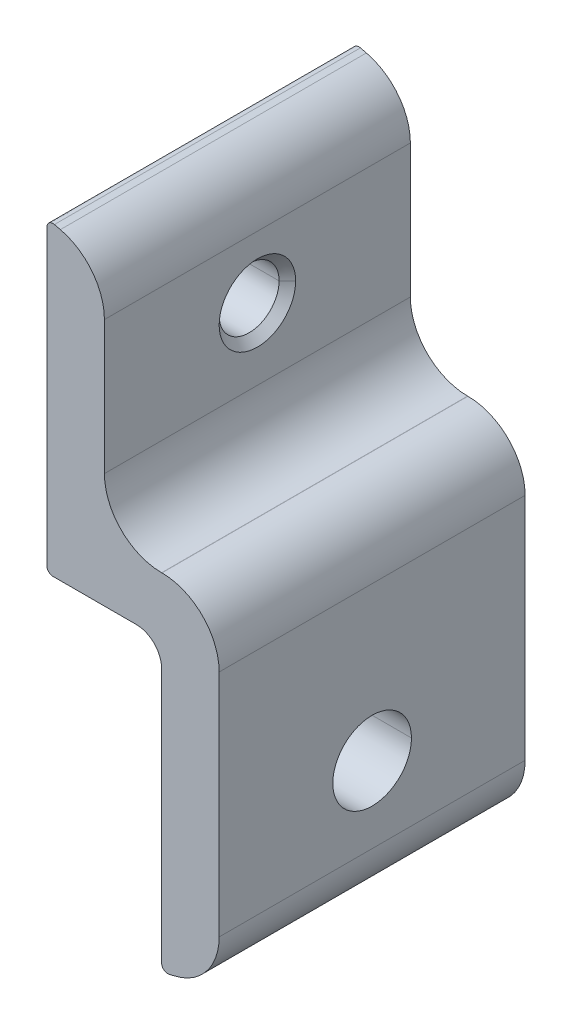
ISO-10303-21;
HEADER;
FILE_DESCRIPTION(('STEP AP214'),'2;1');
FILE_NAME('part.step','',(''),(''),'','','');
FILE_SCHEMA(('AUTOMOTIVE_DESIGN { 1 0 10303 214 1 1 1 1 }'));
ENDSEC;
DATA;
#1=APPLICATION_CONTEXT('core data for automotive mechanical design processes');
#2=APPLICATION_PROTOCOL_DEFINITION('international standard','automotive_design',2000,#1);
#3=PRODUCT_CONTEXT('',#1,'mechanical');
#4=PRODUCT('Part','Part','',(#3));
#5=PRODUCT_RELATED_PRODUCT_CATEGORY('part','',(#4));
#6=PRODUCT_DEFINITION_FORMATION('','',#4);
#7=PRODUCT_DEFINITION_CONTEXT('part definition',#1,'design');
#8=PRODUCT_DEFINITION('design','',#6,#7);
#9=PRODUCT_DEFINITION_SHAPE('','',#8);
#10=(LENGTH_UNIT() NAMED_UNIT(*) SI_UNIT(.MILLI.,.METRE.));
#11=(NAMED_UNIT(*) PLANE_ANGLE_UNIT() SI_UNIT($,.RADIAN.));
#12=(NAMED_UNIT(*) SI_UNIT($,.STERADIAN.) SOLID_ANGLE_UNIT());
#13=UNCERTAINTY_MEASURE_WITH_UNIT(LENGTH_MEASURE(1.E-05),#10,'distance_accuracy_value','');
#14=(GEOMETRIC_REPRESENTATION_CONTEXT(3) GLOBAL_UNCERTAINTY_ASSIGNED_CONTEXT((#13)) GLOBAL_UNIT_ASSIGNED_CONTEXT((#10,
#11,#12)) REPRESENTATION_CONTEXT('',''));
#15=CARTESIAN_POINT('',(0.,0.,0.));
#16=DIRECTION('',(0.,0.,1.));
#17=DIRECTION('',(1.,0.,0.));
#18=AXIS2_PLACEMENT_3D('',#15,#16,#17);
#19=CARTESIAN_POINT('',(4.7752,9.525,12.7));
#20=DIRECTION('',(-1.,0.,0.));
#21=DIRECTION('',(0.,0.,1.));
#22=AXIS2_PLACEMENT_3D('',#19,#20,#21);
#23=PLANE('',#22);
#24=CARTESIAN_POINT('',(4.7752,15.4432,0.));
#25=DIRECTION('',(1.,0.,0.));
#26=DIRECTION('',(0.,0.,-1.));
#27=AXIS2_PLACEMENT_3D('',#24,#25,#26);
#28=CIRCLE('',#27,3.175);
#29=CARTESIAN_POINT('',(4.7752,15.4432,-3.175));
#30=VERTEX_POINT('',#29);
#31=CARTESIAN_POINT('',(4.7752,15.4432,3.175));
#32=VERTEX_POINT('',#31);
#33=EDGE_CURVE('E11',#30,#32,#28,.T.);
#34=ORIENTED_EDGE('',*,*,#33,.F.);
#35=CARTESIAN_POINT('',(4.7752,15.4432,0.));
#36=DIRECTION('',(1.,0.,0.));
#37=DIRECTION('',(0.,0.,-1.));
#38=AXIS2_PLACEMENT_3D('',#35,#36,#37);
#39=CIRCLE('',#38,3.175);
#40=EDGE_CURVE('E25',#32,#30,#39,.T.);
#41=ORIENTED_EDGE('',*,*,#40,.F.);
#42=EDGE_LOOP('',(#34,#41));
#43=FACE_BOUND('',#42,.T.);
#44=DIRECTION('',(0.,1.,0.));
#45=VECTOR('',#44,1.);
#46=CARTESIAN_POINT('',(4.7752,9.525,-12.7));
#47=LINE('',#46,#45);
#48=CARTESIAN_POINT('',(4.7752,9.52499999999987,-12.7));
#49=VERTEX_POINT('',#48);
#50=CARTESIAN_POINT('',(4.7752,20.5994,-12.7));
#51=VERTEX_POINT('',#50);
#52=EDGE_CURVE('E591',#49,#51,#47,.T.);
#53=ORIENTED_EDGE('',*,*,#52,.T.);
#54=DIRECTION('',(0.,0.,-1.));
#55=VECTOR('',#54,1.);
#56=CARTESIAN_POINT('',(4.7752,20.5994,12.7));
#57=LINE('',#56,#55);
#58=CARTESIAN_POINT('',(4.7752,20.5994,12.7));
#59=VERTEX_POINT('',#58);
#60=EDGE_CURVE('E586',#59,#51,#57,.T.);
#61=ORIENTED_EDGE('',*,*,#60,.F.);
#62=DIRECTION('',(0.,1.,0.));
#63=VECTOR('',#62,1.);
#64=CARTESIAN_POINT('',(4.7752,9.525,12.7));
#65=LINE('',#64,#63);
#66=CARTESIAN_POINT('',(4.7752,9.52499999999987,12.7));
#67=VERTEX_POINT('',#66);
#68=EDGE_CURVE('E581',#67,#59,#65,.T.);
#69=ORIENTED_EDGE('',*,*,#68,.F.);
#70=DIRECTION('',(0.,0.,-1.));
#71=VECTOR('',#70,1.);
#72=CARTESIAN_POINT('',(4.7752,9.52499999999987,12.7));
#73=LINE('',#72,#71);
#74=EDGE_CURVE('E577',#67,#49,#73,.T.);
#75=ORIENTED_EDGE('',*,*,#74,.T.);
#76=EDGE_LOOP('',(#53,#61,#69,#75));
#77=FACE_BOUND('',#76,.T.);
#78=ADVANCED_FACE('F17',(#43,#77),#23,.F.);
#79=CARTESIAN_POINT('',(9.52499999999987,9.52499999999987,12.7));
#80=DIRECTION('',(0.,0.,1.));
#81=DIRECTION('',(0.707106781186538,0.707106781186557,0.));
#82=AXIS2_PLACEMENT_3D('',#79,#80,#81);
#83=CYLINDRICAL_SURFACE('',#82,4.74979999999987);
#84=DIRECTION('',(0.,0.,-1.));
#85=VECTOR('',#84,1.);
#86=CARTESIAN_POINT('',(9.525,4.7752,12.7));
#87=LINE('',#86,#85);
#88=CARTESIAN_POINT('',(9.525,4.7752,12.7));
#89=VERTEX_POINT('',#88);
#90=CARTESIAN_POINT('',(9.525,4.7752,-12.7));
#91=VERTEX_POINT('',#90);
#92=EDGE_CURVE('E573',#89,#91,#87,.T.);
#93=ORIENTED_EDGE('',*,*,#92,.T.);
#94=CARTESIAN_POINT('',(9.52499999999987,9.52499999999987,-12.7));
#95=DIRECTION('',(0.,0.,1.));
#96=DIRECTION('',(1.,0.,0.));
#97=AXIS2_PLACEMENT_3D('',#94,#95,#96);
#98=CIRCLE('',#97,4.74979999999987);
#99=EDGE_CURVE('E568',#49,#91,#98,.T.);
#100=ORIENTED_EDGE('',*,*,#99,.F.);
#101=ORIENTED_EDGE('',*,*,#74,.F.);
#102=CARTESIAN_POINT('',(9.52499999999987,9.52499999999987,12.7));
#103=DIRECTION('',(0.,0.,1.));
#104=DIRECTION('',(1.,0.,0.));
#105=AXIS2_PLACEMENT_3D('',#102,#103,#104);
#106=CIRCLE('',#105,4.74979999999987);
#107=EDGE_CURVE('E564',#67,#89,#106,.T.);
#108=ORIENTED_EDGE('',*,*,#107,.T.);
#109=EDGE_LOOP('',(#93,#100,#101,#108));
#110=FACE_BOUND('',#109,.T.);
#111=ADVANCED_FACE('F605',(#110),#83,.F.);
#112=CARTESIAN_POINT('',(0.507999999999987,0.507999999999987,12.7));
#113=DIRECTION('',(0.,0.,1.));
#114=DIRECTION('',(1.,0.,0.));
#115=AXIS2_PLACEMENT_3D('',#112,#113,#114);
#116=PLANE('',#115);
#117=DIRECTION('',(0.,-1.,0.));
#118=VECTOR('',#117,1.);
#119=CARTESIAN_POINT('',(0.,24.8666,12.7));
#120=LINE('',#119,#118);
#121=CARTESIAN_POINT('',(0.,24.8666,12.7));
#122=VERTEX_POINT('',#121);
#123=CARTESIAN_POINT('',(0.,0.507999999999987,12.7));
#124=VERTEX_POINT('',#123);
#125=EDGE_CURVE('E560',#122,#124,#120,.T.);
#126=ORIENTED_EDGE('',*,*,#125,.T.);
#127=CARTESIAN_POINT('',(0.507999999999987,0.507999999999987,12.7));
#128=DIRECTION('',(0.,0.,1.));
#129=DIRECTION('',(1.,0.,0.));
#130=AXIS2_PLACEMENT_3D('',#127,#128,#129);
#131=CIRCLE('',#130,0.507999999999987);
#132=CARTESIAN_POINT('',(0.507999999999987,0.,12.7));
#133=VERTEX_POINT('',#132);
#134=EDGE_CURVE('E556',#124,#133,#131,.T.);
#135=ORIENTED_EDGE('',*,*,#134,.T.);
#136=DIRECTION('',(1.,0.,0.));
#137=VECTOR('',#136,1.);
#138=CARTESIAN_POINT('',(0.508,0.,12.7));
#139=LINE('',#138,#137);
#140=CARTESIAN_POINT('',(7.4168,0.,12.7));
#141=VERTEX_POINT('',#140);
#142=EDGE_CURVE('E552',#133,#141,#139,.T.);
#143=ORIENTED_EDGE('',*,*,#142,.T.);
#144=CARTESIAN_POINT('',(7.41680000000002,-2.10819999999996,12.7));
#145=DIRECTION('',(0.,0.,1.));
#146=DIRECTION('',(1.,0.,0.));
#147=AXIS2_PLACEMENT_3D('',#144,#145,#146);
#148=CIRCLE('',#147,2.10819999999996);
#149=CARTESIAN_POINT('',(9.525,-2.10819999999996,12.7));
#150=VERTEX_POINT('',#149);
#151=EDGE_CURVE('E547',#150,#141,#148,.T.);
#152=ORIENTED_EDGE('',*,*,#151,.F.);
#153=DIRECTION('',(0.,-1.,0.));
#154=VECTOR('',#153,1.);
#155=CARTESIAN_POINT('',(9.525,-2.1082,12.7));
#156=LINE('',#155,#154);
#157=CARTESIAN_POINT('',(9.525,-23.2918,12.7));
#158=VERTEX_POINT('',#157);
#159=EDGE_CURVE('E543',#150,#158,#156,.T.);
#160=ORIENTED_EDGE('',*,*,#159,.T.);
#161=CARTESIAN_POINT('',(10.0330000000002,-23.2918000000001,12.7));
#162=DIRECTION('',(0.,0.,1.));
#163=DIRECTION('',(1.,0.,0.));
#164=AXIS2_PLACEMENT_3D('',#161,#162,#163);
#165=CIRCLE('',#164,0.508000000000216);
#166=CARTESIAN_POINT('',(10.15226215763,-23.785602124092,12.7));
#167=VERTEX_POINT('',#166);
#168=EDGE_CURVE('E539',#158,#167,#165,.T.);
#169=ORIENTED_EDGE('',*,*,#168,.T.);
#170=DIRECTION('',(0.972051425377323,0.234768026830559,0.));
#171=VECTOR('',#170,1.);
#172=CARTESIAN_POINT('',(10.15226215763,-23.785602124092,12.7));
#173=LINE('',#172,#171);
#174=CARTESIAN_POINT('',(10.646064281722,-23.666339966462,12.7));
#175=VERTEX_POINT('',#174);
#176=EDGE_CURVE('E535',#167,#175,#173,.T.);
#177=ORIENTED_EDGE('',*,*,#176,.T.);
#178=CARTESIAN_POINT('',(9.52499999999985,-19.0246000000003,12.7));
#179=DIRECTION('',(0.,0.,1.));
#180=DIRECTION('',(1.,0.,0.));
#181=AXIS2_PLACEMENT_3D('',#178,#179,#180);
#182=CIRCLE('',#181,4.77520000000015);
#183=CARTESIAN_POINT('',(14.3002,-19.0246000000003,12.7));
#184=VERTEX_POINT('',#183);
#185=EDGE_CURVE('E531',#175,#184,#182,.T.);
#186=ORIENTED_EDGE('',*,*,#185,.T.);
#187=DIRECTION('',(0.,1.,0.));
#188=VECTOR('',#187,1.);
#189=CARTESIAN_POINT('',(14.3002,-19.0246,12.7));
#190=LINE('',#189,#188);
#191=CARTESIAN_POINT('',(14.3002,0.0253999999999983,12.7));
#192=VERTEX_POINT('',#191);
#193=EDGE_CURVE('E527',#184,#192,#190,.T.);
#194=ORIENTED_EDGE('',*,*,#193,.T.);
#195=CARTESIAN_POINT('',(9.5504000000003,0.0254000000002934,12.7));
#196=DIRECTION('',(0.,0.,1.));
#197=DIRECTION('',(1.,0.,0.));
#198=AXIS2_PLACEMENT_3D('',#195,#196,#197);
#199=CIRCLE('',#198,4.74979999999969);
#200=CARTESIAN_POINT('',(9.5504000000003,4.7752,12.7));
#201=VERTEX_POINT('',#200);
#202=EDGE_CURVE('E523',#192,#201,#199,.T.);
#203=ORIENTED_EDGE('',*,*,#202,.T.);
#204=DIRECTION('',(-1.,0.,0.));
#205=VECTOR('',#204,1.);
#206=CARTESIAN_POINT('',(9.5504,4.7752,12.7));
#207=LINE('',#206,#205);
#208=EDGE_CURVE('E518',#201,#89,#207,.T.);
#209=ORIENTED_EDGE('',*,*,#208,.T.);
#210=ORIENTED_EDGE('',*,*,#107,.F.);
#211=ORIENTED_EDGE('',*,*,#68,.T.);
#212=CARTESIAN_POINT('',(-8.34401991944845E-13,20.5993999999996,12.7));
#213=DIRECTION('',(0.,0.,1.));
#214=DIRECTION('',(1.,0.,0.));
#215=AXIS2_PLACEMENT_3D('',#212,#213,#214);
#216=CIRCLE('',#215,4.77520000000084);
#217=CARTESIAN_POINT('',(1.1210642817217,25.241139966462,12.7));
#218=VERTEX_POINT('',#217);
#219=EDGE_CURVE('E514',#59,#218,#216,.T.);
#220=ORIENTED_EDGE('',*,*,#219,.T.);
#221=DIRECTION('',(-0.972051425377295,0.234768026830676,0.));
#222=VECTOR('',#221,1.);
#223=CARTESIAN_POINT('',(1.1210642817217,25.241139966462,12.7));
#224=LINE('',#223,#222);
#225=CARTESIAN_POINT('',(0.62726215762996,25.360402124092,12.7));
#226=VERTEX_POINT('',#225);
#227=EDGE_CURVE('E510',#218,#226,#224,.T.);
#228=ORIENTED_EDGE('',*,*,#227,.T.);
#229=CARTESIAN_POINT('',(0.508000000000218,24.8666,12.7));
#230=DIRECTION('',(0.,0.,1.));
#231=DIRECTION('',(1.,0.,0.));
#232=AXIS2_PLACEMENT_3D('',#229,#230,#231);
#233=CIRCLE('',#232,0.508000000000218);
#234=EDGE_CURVE('E506',#226,#122,#233,.T.);
#235=ORIENTED_EDGE('',*,*,#234,.T.);
#236=EDGE_LOOP('',(#126,#135,#143,#152,#160,#169,#177,#186,#194,#203,#209,#210,#211,#220,#228,#235));
#237=FACE_BOUND('',#236,.T.);
#238=ADVANCED_FACE('F609',(#237),#116,.T.);
#239=CARTESIAN_POINT('',(0.508000000000218,24.8666,12.7));
#240=DIRECTION('',(0.,0.,1.));
#241=DIRECTION('',(0.618559606331476,-0.785737878312513,0.));
#242=AXIS2_PLACEMENT_3D('',#239,#240,#241);
#243=CYLINDRICAL_SURFACE('',#242,0.508000000000218);
#244=CARTESIAN_POINT('',(0.508000000000218,24.8666,-12.7));
#245=DIRECTION('',(0.,0.,1.));
#246=DIRECTION('',(1.,0.,0.));
#247=AXIS2_PLACEMENT_3D('',#244,#245,#246);
#248=CIRCLE('',#247,0.508000000000218);
#249=CARTESIAN_POINT('',(0.62726215762996,25.360402124092,-12.7));
#250=VERTEX_POINT('',#249);
#251=CARTESIAN_POINT('',(0.,24.8666,-12.7));
#252=VERTEX_POINT('',#251);
#253=EDGE_CURVE('E502',#250,#252,#248,.T.);
#254=ORIENTED_EDGE('',*,*,#253,.T.);
#255=DIRECTION('',(0.,0.,-1.));
#256=VECTOR('',#255,1.);
#257=CARTESIAN_POINT('',(0.,24.8666,12.7));
#258=LINE('',#257,#256);
#259=EDGE_CURVE('E497',#122,#252,#258,.T.);
#260=ORIENTED_EDGE('',*,*,#259,.F.);
#261=ORIENTED_EDGE('',*,*,#234,.F.);
#262=DIRECTION('',(0.,0.,-1.));
#263=VECTOR('',#262,1.);
#264=CARTESIAN_POINT('',(0.62726215762996,25.360402124092,12.7));
#265=LINE('',#264,#263);
#266=EDGE_CURVE('E493',#226,#250,#265,.T.);
#267=ORIENTED_EDGE('',*,*,#266,.T.);
#268=EDGE_LOOP('',(#254,#260,#261,#267));
#269=FACE_BOUND('',#268,.T.);
#270=ADVANCED_FACE('F633',(#269),#243,.T.);
#271=CARTESIAN_POINT('',(1.1210642817217,25.241139966462,12.7));
#272=DIRECTION('',(-0.234768026830676,-0.972051425377295,0.));
#273=DIRECTION('',(0.972051425377295,-0.234768026830676,0.));
#274=AXIS2_PLACEMENT_3D('',#271,#272,#273);
#275=PLANE('',#274);
#276=DIRECTION('',(-0.972051425377295,0.234768026830676,0.));
#277=VECTOR('',#276,1.);
#278=CARTESIAN_POINT('',(1.1210642817217,25.241139966462,-12.7));
#279=LINE('',#278,#277);
#280=CARTESIAN_POINT('',(1.1210642817217,25.241139966462,-12.7));
#281=VERTEX_POINT('',#280);
#282=EDGE_CURVE('E488',#281,#250,#279,.T.);
#283=ORIENTED_EDGE('',*,*,#282,.T.);
#284=ORIENTED_EDGE('',*,*,#266,.F.);
#285=ORIENTED_EDGE('',*,*,#227,.F.);
#286=DIRECTION('',(0.,0.,-1.));
#287=VECTOR('',#286,1.);
#288=CARTESIAN_POINT('',(1.1210642817217,25.241139966462,12.7));
#289=LINE('',#288,#287);
#290=EDGE_CURVE('E484',#218,#281,#289,.T.);
#291=ORIENTED_EDGE('',*,*,#290,.T.);
#292=EDGE_LOOP('',(#283,#284,#285,#291));
#293=FACE_BOUND('',#292,.T.);
#294=ADVANCED_FACE('F627',(#293),#275,.F.);
#295=CARTESIAN_POINT('',(-8.34401991944845E-13,20.5993999999996,12.7));
#296=DIRECTION('',(0.,0.,1.));
#297=DIRECTION('',(-0.785737878312729,-0.618559606331201,0.));
#298=AXIS2_PLACEMENT_3D('',#295,#296,#297);
#299=CYLINDRICAL_SURFACE('',#298,4.77520000000084);
#300=CARTESIAN_POINT('',(-8.34401991944845E-13,20.5993999999996,-12.7));
#301=DIRECTION('',(0.,0.,1.));
#302=DIRECTION('',(1.,0.,0.));
#303=AXIS2_PLACEMENT_3D('',#300,#301,#302);
#304=CIRCLE('',#303,4.77520000000084);
#305=EDGE_CURVE('E479',#51,#281,#304,.T.);
#306=ORIENTED_EDGE('',*,*,#305,.T.);
#307=ORIENTED_EDGE('',*,*,#290,.F.);
#308=ORIENTED_EDGE('',*,*,#219,.F.);
#309=ORIENTED_EDGE('',*,*,#60,.T.);
#310=EDGE_LOOP('',(#306,#307,#308,#309));
#311=FACE_BOUND('',#310,.T.);
#312=ADVANCED_FACE('F619',(#311),#299,.T.);
#313=CARTESIAN_POINT('',(0.507999999999987,0.507999999999987,-12.7));
#314=DIRECTION('',(0.,0.,1.));
#315=DIRECTION('',(1.,0.,0.));
#316=AXIS2_PLACEMENT_3D('',#313,#314,#315);
#317=PLANE('',#316);
#318=DIRECTION('',(0.,-1.,0.));
#319=VECTOR('',#318,1.);
#320=CARTESIAN_POINT('',(0.,24.8666,-12.7));
#321=LINE('',#320,#319);
#322=CARTESIAN_POINT('',(0.,0.507999999999987,-12.7));
#323=VERTEX_POINT('',#322);
#324=EDGE_CURVE('E474',#252,#323,#321,.T.);
#325=ORIENTED_EDGE('',*,*,#324,.F.);
#326=ORIENTED_EDGE('',*,*,#253,.F.);
#327=ORIENTED_EDGE('',*,*,#282,.F.);
#328=ORIENTED_EDGE('',*,*,#305,.F.);
#329=ORIENTED_EDGE('',*,*,#52,.F.);
#330=ORIENTED_EDGE('',*,*,#99,.T.);
#331=DIRECTION('',(-1.,0.,0.));
#332=VECTOR('',#331,1.);
#333=CARTESIAN_POINT('',(9.5504,4.7752,-12.7));
#334=LINE('',#333,#332);
#335=CARTESIAN_POINT('',(9.5504000000003,4.7752,-12.7));
#336=VERTEX_POINT('',#335);
#337=EDGE_CURVE('E469',#336,#91,#334,.T.);
#338=ORIENTED_EDGE('',*,*,#337,.F.);
#339=CARTESIAN_POINT('',(9.5504000000003,0.0254000000002934,-12.7));
#340=DIRECTION('',(0.,0.,1.));
#341=DIRECTION('',(1.,0.,0.));
#342=AXIS2_PLACEMENT_3D('',#339,#340,#341);
#343=CIRCLE('',#342,4.74979999999969);
#344=CARTESIAN_POINT('',(14.3002,0.0253999999999983,-12.7));
#345=VERTEX_POINT('',#344);
#346=EDGE_CURVE('E464',#345,#336,#343,.T.);
#347=ORIENTED_EDGE('',*,*,#346,.F.);
#348=DIRECTION('',(0.,1.,0.));
#349=VECTOR('',#348,1.);
#350=CARTESIAN_POINT('',(14.3002,-19.0246,-12.7));
#351=LINE('',#350,#349);
#352=CARTESIAN_POINT('',(14.3002,-19.0246000000003,-12.7));
#353=VERTEX_POINT('',#352);
#354=EDGE_CURVE('E459',#353,#345,#351,.T.);
#355=ORIENTED_EDGE('',*,*,#354,.F.);
#356=CARTESIAN_POINT('',(9.52499999999985,-19.0246000000003,-12.7));
#357=DIRECTION('',(0.,0.,1.));
#358=DIRECTION('',(1.,0.,0.));
#359=AXIS2_PLACEMENT_3D('',#356,#357,#358);
#360=CIRCLE('',#359,4.77520000000015);
#361=CARTESIAN_POINT('',(10.646064281722,-23.666339966462,-12.7));
#362=VERTEX_POINT('',#361);
#363=EDGE_CURVE('E454',#362,#353,#360,.T.);
#364=ORIENTED_EDGE('',*,*,#363,.F.);
#365=DIRECTION('',(0.972051425377323,0.234768026830559,0.));
#366=VECTOR('',#365,1.);
#367=CARTESIAN_POINT('',(10.15226215763,-23.785602124092,-12.7));
#368=LINE('',#367,#366);
#369=CARTESIAN_POINT('',(10.15226215763,-23.785602124092,-12.7));
#370=VERTEX_POINT('',#369);
#371=EDGE_CURVE('E449',#370,#362,#368,.T.);
#372=ORIENTED_EDGE('',*,*,#371,.F.);
#373=CARTESIAN_POINT('',(10.0330000000002,-23.2918000000001,-12.7));
#374=DIRECTION('',(0.,0.,1.));
#375=DIRECTION('',(1.,0.,0.));
#376=AXIS2_PLACEMENT_3D('',#373,#374,#375);
#377=CIRCLE('',#376,0.508000000000216);
#378=CARTESIAN_POINT('',(9.525,-23.2918,-12.7));
#379=VERTEX_POINT('',#378);
#380=EDGE_CURVE('E444',#379,#370,#377,.T.);
#381=ORIENTED_EDGE('',*,*,#380,.F.);
#382=DIRECTION('',(0.,-1.,0.));
#383=VECTOR('',#382,1.);
#384=CARTESIAN_POINT('',(9.525,-2.1082,-12.7));
#385=LINE('',#384,#383);
#386=CARTESIAN_POINT('',(9.525,-2.10819999999996,-12.7));
#387=VERTEX_POINT('',#386);
#388=EDGE_CURVE('E439',#387,#379,#385,.T.);
#389=ORIENTED_EDGE('',*,*,#388,.F.);
#390=CARTESIAN_POINT('',(7.41680000000002,-2.10819999999996,-12.7));
#391=DIRECTION('',(0.,0.,1.));
#392=DIRECTION('',(1.,0.,0.));
#393=AXIS2_PLACEMENT_3D('',#390,#391,#392);
#394=CIRCLE('',#393,2.10819999999996);
#395=CARTESIAN_POINT('',(7.4168,0.,-12.7));
#396=VERTEX_POINT('',#395);
#397=EDGE_CURVE('E435',#387,#396,#394,.T.);
#398=ORIENTED_EDGE('',*,*,#397,.T.);
#399=DIRECTION('',(1.,0.,0.));
#400=VECTOR('',#399,1.);
#401=CARTESIAN_POINT('',(0.508,0.,-12.7));
#402=LINE('',#401,#400);
#403=CARTESIAN_POINT('',(0.507999999999987,0.,-12.7));
#404=VERTEX_POINT('',#403);
#405=EDGE_CURVE('E430',#404,#396,#402,.T.);
#406=ORIENTED_EDGE('',*,*,#405,.F.);
#407=CARTESIAN_POINT('',(0.507999999999987,0.507999999999987,-12.7));
#408=DIRECTION('',(0.,0.,1.));
#409=DIRECTION('',(1.,0.,0.));
#410=AXIS2_PLACEMENT_3D('',#407,#408,#409);
#411=CIRCLE('',#410,0.507999999999987);
#412=EDGE_CURVE('E425',#323,#404,#411,.T.);
#413=ORIENTED_EDGE('',*,*,#412,.F.);
#414=EDGE_LOOP('',(#325,#326,#327,#328,#329,#330,#338,#347,#355,#364,#372,#381,#389,#398,#406,#413));
#415=FACE_BOUND('',#414,.T.);
#416=ADVANCED_FACE('F623',(#415),#317,.F.);
#417=CARTESIAN_POINT('',(0.507999999999987,0.507999999999987,12.7));
#418=DIRECTION('',(0.,0.,1.));
#419=DIRECTION('',(0.707106781186547,0.707106781186548,0.));
#420=AXIS2_PLACEMENT_3D('',#417,#418,#419);
#421=CYLINDRICAL_SURFACE('',#420,0.507999999999987);
#422=ORIENTED_EDGE('',*,*,#412,.T.);
#423=DIRECTION('',(0.,0.,-1.));
#424=VECTOR('',#423,1.);
#425=CARTESIAN_POINT('',(0.507999999999987,0.,12.7));
#426=LINE('',#425,#424);
#427=EDGE_CURVE('E420',#133,#404,#426,.T.);
#428=ORIENTED_EDGE('',*,*,#427,.F.);
#429=ORIENTED_EDGE('',*,*,#134,.F.);
#430=DIRECTION('',(0.,0.,-1.));
#431=VECTOR('',#430,1.);
#432=CARTESIAN_POINT('',(0.,0.507999999999987,12.7));
#433=LINE('',#432,#431);
#434=EDGE_CURVE('E415',#124,#323,#433,.T.);
#435=ORIENTED_EDGE('',*,*,#434,.T.);
#436=EDGE_LOOP('',(#422,#428,#429,#435));
#437=FACE_BOUND('',#436,.T.);
#438=ADVANCED_FACE('F641',(#437),#421,.T.);
#439=CARTESIAN_POINT('',(0.,24.8666,12.7));
#440=DIRECTION('',(1.,0.,0.));
#441=DIRECTION('',(0.,0.,-1.));
#442=AXIS2_PLACEMENT_3D('',#439,#440,#441);
#443=PLANE('',#442);
#444=CARTESIAN_POINT('',(0.,15.4432,0.));
#445=DIRECTION('',(1.,0.,0.));
#446=DIRECTION('',(0.,0.,-1.));
#447=AXIS2_PLACEMENT_3D('',#444,#445,#446);
#448=CIRCLE('',#447,3.175);
#449=CARTESIAN_POINT('',(0.,15.4432,-3.175));
#450=VERTEX_POINT('',#449);
#451=CARTESIAN_POINT('',(0.,15.4432,3.175));
#452=VERTEX_POINT('',#451);
#453=EDGE_CURVE('E411',#450,#452,#448,.T.);
#454=ORIENTED_EDGE('',*,*,#453,.T.);
#455=CARTESIAN_POINT('',(0.,15.4432,0.));
#456=DIRECTION('',(1.,0.,0.));
#457=DIRECTION('',(0.,0.,-1.));
#458=AXIS2_PLACEMENT_3D('',#455,#456,#457);
#459=CIRCLE('',#458,3.175);
#460=EDGE_CURVE('E409',#452,#450,#459,.T.);
#461=ORIENTED_EDGE('',*,*,#460,.T.);
#462=EDGE_LOOP('',(#454,#461));
#463=FACE_BOUND('',#462,.T.);
#464=ORIENTED_EDGE('',*,*,#324,.T.);
#465=ORIENTED_EDGE('',*,*,#434,.F.);
#466=ORIENTED_EDGE('',*,*,#125,.F.);
#467=ORIENTED_EDGE('',*,*,#259,.T.);
#468=EDGE_LOOP('',(#464,#465,#466,#467));
#469=FACE_BOUND('',#468,.T.);
#470=ADVANCED_FACE('F637',(#463,#469),#443,.F.);
#471=CARTESIAN_POINT('',(0.,15.4432,0.));
#472=DIRECTION('',(-1.,0.,0.));
#473=DIRECTION('',(0.,1.,0.));
#474=AXIS2_PLACEMENT_3D('',#471,#472,#473);
#475=CONICAL_SURFACE('',#474,3.175,0.78539816339745);
#476=ORIENTED_EDGE('',*,*,#460,.F.);
#477=CARTESIAN_POINT('',(0.687069999999999,15.4432,2.48793));
#478=DIRECTION('',(-0.707106781186546,0.,0.707106781186549));
#479=VECTOR('',#478,1.);
#480=LINE('',#477,#479);
#481=CARTESIAN_POINT('',(0.687069999999999,15.4432,2.48793));
#482=VERTEX_POINT('',#481);
#483=EDGE_CURVE('E379',#482,#452,#480,.T.);
#484=ORIENTED_EDGE('',*,*,#483,.F.);
#485=CARTESIAN_POINT('',(0.68707,15.4432,0.));
#486=DIRECTION('',(1.,0.,0.));
#487=DIRECTION('',(0.,0.,-1.));
#488=AXIS2_PLACEMENT_3D('',#485,#486,#487);
#489=CIRCLE('',#488,2.48793);
#490=CARTESIAN_POINT('',(0.68707,15.4432,-2.48793));
#491=VERTEX_POINT('',#490);
#492=EDGE_CURVE('E396',#482,#491,#489,.T.);
#493=ORIENTED_EDGE('',*,*,#492,.T.);
#494=CARTESIAN_POINT('',(0.687069999999999,15.4432,-2.48793));
#495=DIRECTION('',(-0.707106781186546,0.,-0.707106781186549));
#496=VECTOR('',#495,1.);
#497=LINE('',#494,#496);
#498=EDGE_CURVE('E381',#491,#450,#497,.T.);
#499=ORIENTED_EDGE('',*,*,#498,.T.);
#500=EDGE_LOOP('',(#476,#484,#493,#499));
#501=FACE_BOUND('',#500,.T.);
#502=ADVANCED_FACE('F362',(#501),#475,.F.);
#503=CARTESIAN_POINT('',(0.,15.4432,0.));
#504=DIRECTION('',(-1.,0.,0.));
#505=DIRECTION('',(0.,-1.,0.));
#506=AXIS2_PLACEMENT_3D('',#503,#504,#505);
#507=CONICAL_SURFACE('',#506,3.175,0.78539816339745);
#508=CARTESIAN_POINT('',(0.68707,15.4432,0.));
#509=DIRECTION('',(1.,0.,0.));
#510=DIRECTION('',(0.,0.,-1.));
#511=AXIS2_PLACEMENT_3D('',#508,#509,#510);
#512=CIRCLE('',#511,2.48793);
#513=EDGE_CURVE('E345',#491,#482,#512,.T.);
#514=ORIENTED_EDGE('',*,*,#513,.T.);
#515=ORIENTED_EDGE('',*,*,#483,.T.);
#516=ORIENTED_EDGE('',*,*,#453,.F.);
#517=ORIENTED_EDGE('',*,*,#498,.F.);
#518=EDGE_LOOP('',(#514,#515,#516,#517));
#519=FACE_BOUND('',#518,.T.);
#520=ADVANCED_FACE('F353',(#519),#507,.F.);
#521=CARTESIAN_POINT('',(4.7752,15.4432,0.));
#522=DIRECTION('',(-1.,0.,0.));
#523=DIRECTION('',(0.,-1.,0.));
#524=AXIS2_PLACEMENT_3D('',#521,#522,#523);
#525=CYLINDRICAL_SURFACE('',#524,2.48793);
#526=CARTESIAN_POINT('',(4.08813,15.4432,0.));
#527=DIRECTION('',(1.,0.,0.));
#528=DIRECTION('',(0.,0.,-1.));
#529=AXIS2_PLACEMENT_3D('',#526,#527,#528);
#530=CIRCLE('',#529,2.48793);
#531=CARTESIAN_POINT('',(4.08813,15.4432,-2.48793));
#532=VERTEX_POINT('',#531);
#533=CARTESIAN_POINT('',(4.08813,15.4432,2.48793));
#534=VERTEX_POINT('',#533);
#535=EDGE_CURVE('E343',#532,#534,#530,.T.);
#536=ORIENTED_EDGE('',*,*,#535,.T.);
#537=CARTESIAN_POINT('',(4.08813,15.4432,2.48793));
#538=DIRECTION('',(-1.,0.,0.));
#539=VECTOR('',#538,1.);
#540=LINE('',#537,#539);
#541=EDGE_CURVE('E321',#534,#482,#540,.T.);
#542=ORIENTED_EDGE('',*,*,#541,.T.);
#543=ORIENTED_EDGE('',*,*,#513,.F.);
#544=CARTESIAN_POINT('',(4.08813,15.4432,-2.48793));
#545=DIRECTION('',(-1.,0.,0.));
#546=VECTOR('',#545,1.);
#547=LINE('',#544,#546);
#548=EDGE_CURVE('E333',#532,#491,#547,.T.);
#549=ORIENTED_EDGE('',*,*,#548,.F.);
#550=EDGE_LOOP('',(#536,#542,#543,#549));
#551=FACE_BOUND('',#550,.T.);
#552=ADVANCED_FACE('F300',(#551),#525,.F.);
#553=CARTESIAN_POINT('',(4.7752,15.4432,0.));
#554=DIRECTION('',(-1.,0.,0.));
#555=DIRECTION('',(0.,1.,0.));
#556=AXIS2_PLACEMENT_3D('',#553,#554,#555);
#557=CYLINDRICAL_SURFACE('',#556,2.48793);
#558=ORIENTED_EDGE('',*,*,#492,.F.);
#559=ORIENTED_EDGE('',*,*,#541,.F.);
#560=CARTESIAN_POINT('',(4.08813,15.4432,0.));
#561=DIRECTION('',(1.,0.,0.));
#562=DIRECTION('',(0.,0.,-1.));
#563=AXIS2_PLACEMENT_3D('',#560,#561,#562);
#564=CIRCLE('',#563,2.48793);
#565=EDGE_CURVE('E599',#534,#532,#564,.T.);
#566=ORIENTED_EDGE('',*,*,#565,.T.);
#567=ORIENTED_EDGE('',*,*,#548,.T.);
#568=EDGE_LOOP('',(#558,#559,#566,#567));
#569=FACE_BOUND('',#568,.T.);
#570=ADVANCED_FACE('F291',(#569),#557,.F.);
#571=CARTESIAN_POINT('',(4.08813,15.4432,0.));
#572=DIRECTION('',(1.,0.,0.));
#573=DIRECTION('',(0.,1.,0.));
#574=AXIS2_PLACEMENT_3D('',#571,#572,#573);
#575=CONICAL_SURFACE('',#574,2.48793,0.785398163397449);
#576=ORIENTED_EDGE('',*,*,#565,.F.);
#577=CARTESIAN_POINT('',(4.08813,15.4432,2.48793));
#578=DIRECTION('',(0.707106781186547,0.,0.707106781186548));
#579=VECTOR('',#578,1.);
#580=LINE('',#577,#579);
#581=EDGE_CURVE('E264',#534,#32,#580,.T.);
#582=ORIENTED_EDGE('',*,*,#581,.T.);
#583=ORIENTED_EDGE('',*,*,#40,.T.);
#584=CARTESIAN_POINT('',(4.08813,15.4432,-2.48793));
#585=DIRECTION('',(0.707106781186547,0.,-0.707106781186548));
#586=VECTOR('',#585,1.);
#587=LINE('',#584,#586);
#588=EDGE_CURVE('E227',#532,#30,#587,.T.);
#589=ORIENTED_EDGE('',*,*,#588,.F.);
#590=EDGE_LOOP('',(#576,#582,#583,#589));
#591=FACE_BOUND('',#590,.T.);
#592=ADVANCED_FACE('F247',(#591),#575,.F.);
#593=CARTESIAN_POINT('',(4.08813,15.4432,0.));
#594=DIRECTION('',(1.,0.,0.));
#595=DIRECTION('',(0.,-1.,0.));
#596=AXIS2_PLACEMENT_3D('',#593,#594,#595);
#597=CONICAL_SURFACE('',#596,2.48793,0.785398163397449);
#598=ORIENTED_EDGE('',*,*,#33,.T.);
#599=ORIENTED_EDGE('',*,*,#581,.F.);
#600=ORIENTED_EDGE('',*,*,#535,.F.);
#601=ORIENTED_EDGE('',*,*,#588,.T.);
#602=EDGE_LOOP('',(#598,#599,#600,#601));
#603=FACE_BOUND('',#602,.T.);
#604=ADVANCED_FACE('F236',(#603),#597,.F.);
#605=CARTESIAN_POINT('',(0.508,0.,12.7));
#606=DIRECTION('',(0.,1.,0.));
#607=DIRECTION('',(0.,0.,1.));
#608=AXIS2_PLACEMENT_3D('',#605,#606,#607);
#609=PLANE('',#608);
#610=ORIENTED_EDGE('',*,*,#405,.T.);
#611=DIRECTION('',(0.,0.,-1.));
#612=VECTOR('',#611,1.);
#613=CARTESIAN_POINT('',(7.4168,0.,12.7));
#614=LINE('',#613,#612);
#615=EDGE_CURVE('E222',#141,#396,#614,.T.);
#616=ORIENTED_EDGE('',*,*,#615,.F.);
#617=ORIENTED_EDGE('',*,*,#142,.F.);
#618=ORIENTED_EDGE('',*,*,#427,.T.);
#619=EDGE_LOOP('',(#610,#616,#617,#618));
#620=FACE_BOUND('',#619,.T.);
#621=ADVANCED_FACE('F246',(#620),#609,.F.);
#622=CARTESIAN_POINT('',(7.41680000000002,-2.10819999999996,12.7));
#623=DIRECTION('',(0.,0.,1.));
#624=DIRECTION('',(-0.707106781186543,-0.707106781186552,0.));
#625=AXIS2_PLACEMENT_3D('',#622,#623,#624);
#626=CYLINDRICAL_SURFACE('',#625,2.10819999999996);
#627=ORIENTED_EDGE('',*,*,#615,.T.);
#628=ORIENTED_EDGE('',*,*,#397,.F.);
#629=DIRECTION('',(0.,0.,-1.));
#630=VECTOR('',#629,1.);
#631=CARTESIAN_POINT('',(9.525,-2.10819999999996,12.7));
#632=LINE('',#631,#630);
#633=EDGE_CURVE('E217',#150,#387,#632,.T.);
#634=ORIENTED_EDGE('',*,*,#633,.F.);
#635=ORIENTED_EDGE('',*,*,#151,.T.);
#636=EDGE_LOOP('',(#627,#628,#634,#635));
#637=FACE_BOUND('',#636,.T.);
#638=ADVANCED_FACE('F650',(#637),#626,.F.);
#639=CARTESIAN_POINT('',(9.525,-2.1082,12.7));
#640=DIRECTION('',(1.,0.,0.));
#641=DIRECTION('',(0.,0.,-1.));
#642=AXIS2_PLACEMENT_3D('',#639,#640,#641);
#643=PLANE('',#642);
#644=CARTESIAN_POINT('',(9.525,-12.7,0.));
#645=DIRECTION('',(1.,0.,0.));
#646=DIRECTION('',(0.,0.,-1.));
#647=AXIS2_PLACEMENT_3D('',#644,#645,#646);
#648=CIRCLE('',#647,3.2639);
#649=CARTESIAN_POINT('',(9.525,-12.7,-3.2639));
#650=VERTEX_POINT('',#649);
#651=CARTESIAN_POINT('',(9.525,-12.7,3.2639));
#652=VERTEX_POINT('',#651);
#653=EDGE_CURVE('E213',#650,#652,#648,.T.);
#654=ORIENTED_EDGE('',*,*,#653,.T.);
#655=CARTESIAN_POINT('',(9.525,-12.7,0.));
#656=DIRECTION('',(1.,0.,0.));
#657=DIRECTION('',(0.,0.,-1.));
#658=AXIS2_PLACEMENT_3D('',#655,#656,#657);
#659=CIRCLE('',#658,3.2639);
#660=EDGE_CURVE('E176',#652,#650,#659,.T.);
#661=ORIENTED_EDGE('',*,*,#660,.T.);
#662=EDGE_LOOP('',(#654,#661));
#663=FACE_BOUND('',#662,.T.);
#664=ORIENTED_EDGE('',*,*,#388,.T.);
#665=DIRECTION('',(0.,0.,-1.));
#666=VECTOR('',#665,1.);
#667=CARTESIAN_POINT('',(9.525,-23.2918,12.7));
#668=LINE('',#667,#666);
#669=EDGE_CURVE('E205',#158,#379,#668,.T.);
#670=ORIENTED_EDGE('',*,*,#669,.F.);
#671=ORIENTED_EDGE('',*,*,#159,.F.);
#672=ORIENTED_EDGE('',*,*,#633,.T.);
#673=EDGE_LOOP('',(#664,#670,#671,#672));
#674=FACE_BOUND('',#673,.T.);
#675=ADVANCED_FACE('F652',(#663,#674),#643,.F.);
#676=CARTESIAN_POINT('',(10.0330000000002,-23.2918000000001,12.7));
#677=DIRECTION('',(0.,0.,1.));
#678=DIRECTION('',(0.618559606331463,0.785737878312523,0.));
#679=AXIS2_PLACEMENT_3D('',#676,#677,#678);
#680=CYLINDRICAL_SURFACE('',#679,0.508000000000216);
#681=ORIENTED_EDGE('',*,*,#380,.T.);
#682=DIRECTION('',(0.,0.,-1.));
#683=VECTOR('',#682,1.);
#684=CARTESIAN_POINT('',(10.15226215763,-23.785602124092,12.7));
#685=LINE('',#684,#683);
#686=EDGE_CURVE('E200',#167,#370,#685,.T.);
#687=ORIENTED_EDGE('',*,*,#686,.F.);
#688=ORIENTED_EDGE('',*,*,#168,.F.);
#689=ORIENTED_EDGE('',*,*,#669,.T.);
#690=EDGE_LOOP('',(#681,#687,#688,#689));
#691=FACE_BOUND('',#690,.T.);
#692=ADVANCED_FACE('F656',(#691),#680,.T.);
#693=CARTESIAN_POINT('',(10.15226215763,-23.785602124092,12.7));
#694=DIRECTION('',(-0.234768026830559,0.972051425377323,0.));
#695=DIRECTION('',(-0.972051425377323,-0.234768026830559,0.));
#696=AXIS2_PLACEMENT_3D('',#693,#694,#695);
#697=PLANE('',#696);
#698=ORIENTED_EDGE('',*,*,#371,.T.);
#699=DIRECTION('',(0.,0.,-1.));
#700=VECTOR('',#699,1.);
#701=CARTESIAN_POINT('',(10.646064281722,-23.666339966462,12.7));
#702=LINE('',#701,#700);
#703=EDGE_CURVE('E189',#175,#362,#702,.T.);
#704=ORIENTED_EDGE('',*,*,#703,.F.);
#705=ORIENTED_EDGE('',*,*,#176,.F.);
#706=ORIENTED_EDGE('',*,*,#686,.T.);
#707=EDGE_LOOP('',(#698,#704,#705,#706));
#708=FACE_BOUND('',#707,.T.);
#709=ADVANCED_FACE('F662',(#708),#697,.F.);
#710=CARTESIAN_POINT('',(9.52499999999985,-19.0246000000003,12.7));
#711=DIRECTION('',(0.,0.,1.));
#712=DIRECTION('',(-0.785737878312714,0.61855960633122,0.));
#713=AXIS2_PLACEMENT_3D('',#710,#711,#712);
#714=CYLINDRICAL_SURFACE('',#713,4.77520000000015);
#715=ORIENTED_EDGE('',*,*,#363,.T.);
#716=DIRECTION('',(0.,0.,-1.));
#717=VECTOR('',#716,1.);
#718=CARTESIAN_POINT('',(14.3002,-19.0246000000003,12.7));
#719=LINE('',#718,#717);
#720=EDGE_CURVE('E186',#184,#353,#719,.T.);
#721=ORIENTED_EDGE('',*,*,#720,.F.);
#722=ORIENTED_EDGE('',*,*,#185,.F.);
#723=ORIENTED_EDGE('',*,*,#703,.T.);
#724=EDGE_LOOP('',(#715,#721,#722,#723));
#725=FACE_BOUND('',#724,.T.);
#726=ADVANCED_FACE('F664',(#725),#714,.T.);
#727=CARTESIAN_POINT('',(14.3002,-19.0246,12.7));
#728=DIRECTION('',(-1.,0.,0.));
#729=DIRECTION('',(0.,0.,1.));
#730=AXIS2_PLACEMENT_3D('',#727,#728,#729);
#731=PLANE('',#730);
#732=CARTESIAN_POINT('',(14.3002,-12.7,0.));
#733=DIRECTION('',(1.,0.,0.));
#734=DIRECTION('',(0.,0.,-1.));
#735=AXIS2_PLACEMENT_3D('',#732,#733,#734);
#736=CIRCLE('',#735,3.2639);
#737=CARTESIAN_POINT('',(14.3002,-12.7,-3.2639));
#738=VERTEX_POINT('',#737);
#739=CARTESIAN_POINT('',(14.3002,-12.7,3.2639));
#740=VERTEX_POINT('',#739);
#741=EDGE_CURVE('E165',#738,#740,#736,.T.);
#742=ORIENTED_EDGE('',*,*,#741,.F.);
#743=CARTESIAN_POINT('',(14.3002,-12.7,0.));
#744=DIRECTION('',(1.,0.,0.));
#745=DIRECTION('',(0.,0.,-1.));
#746=AXIS2_PLACEMENT_3D('',#743,#744,#745);
#747=CIRCLE('',#746,3.2639);
#748=EDGE_CURVE('E160',#740,#738,#747,.T.);
#749=ORIENTED_EDGE('',*,*,#748,.F.);
#750=EDGE_LOOP('',(#742,#749));
#751=FACE_BOUND('',#750,.T.);
#752=ORIENTED_EDGE('',*,*,#354,.T.);
#753=DIRECTION('',(0.,0.,-1.));
#754=VECTOR('',#753,1.);
#755=CARTESIAN_POINT('',(14.3002,0.0253999999999983,12.7));
#756=LINE('',#755,#754);
#757=EDGE_CURVE('E169',#192,#345,#756,.T.);
#758=ORIENTED_EDGE('',*,*,#757,.F.);
#759=ORIENTED_EDGE('',*,*,#193,.F.);
#760=ORIENTED_EDGE('',*,*,#720,.T.);
#761=EDGE_LOOP('',(#752,#758,#759,#760));
#762=FACE_BOUND('',#761,.T.);
#763=ADVANCED_FACE('F162',(#751,#762),#731,.F.);
#764=CARTESIAN_POINT('',(9.5504000000003,0.0254000000002934,12.7));
#765=DIRECTION('',(0.,0.,1.));
#766=DIRECTION('',(-0.70710678118657,-0.707106781186525,0.));
#767=AXIS2_PLACEMENT_3D('',#764,#765,#766);
#768=CYLINDRICAL_SURFACE('',#767,4.74979999999969);
#769=ORIENTED_EDGE('',*,*,#346,.T.);
#770=DIRECTION('',(0.,0.,-1.));
#771=VECTOR('',#770,1.);
#772=CARTESIAN_POINT('',(9.5504000000003,4.7752,12.7));
#773=LINE('',#772,#771);
#774=EDGE_CURVE('E180',#201,#336,#773,.T.);
#775=ORIENTED_EDGE('',*,*,#774,.F.);
#776=ORIENTED_EDGE('',*,*,#202,.F.);
#777=ORIENTED_EDGE('',*,*,#757,.T.);
#778=EDGE_LOOP('',(#769,#775,#776,#777));
#779=FACE_BOUND('',#778,.T.);
#780=ADVANCED_FACE('F675',(#779),#768,.T.);
#781=CARTESIAN_POINT('',(9.5504,4.7752,12.7));
#782=DIRECTION('',(0.,-1.,0.));
#783=DIRECTION('',(0.,0.,-1.));
#784=AXIS2_PLACEMENT_3D('',#781,#782,#783);
#785=PLANE('',#784);
#786=ORIENTED_EDGE('',*,*,#337,.T.);
#787=ORIENTED_EDGE('',*,*,#92,.F.);
#788=ORIENTED_EDGE('',*,*,#208,.F.);
#789=ORIENTED_EDGE('',*,*,#774,.T.);
#790=EDGE_LOOP('',(#786,#787,#788,#789));
#791=FACE_BOUND('',#790,.T.);
#792=ADVANCED_FACE('F677',(#791),#785,.F.);
#793=CARTESIAN_POINT('',(14.3002,-12.7,0.));
#794=DIRECTION('',(1.,0.,0.));
#795=DIRECTION('',(0.,1.,0.));
#796=AXIS2_PLACEMENT_3D('',#793,#794,#795);
#797=CYLINDRICAL_SURFACE('',#796,3.2639);
#798=ORIENTED_EDGE('',*,*,#660,.F.);
#799=CARTESIAN_POINT('',(9.525,-12.7,3.2639));
#800=DIRECTION('',(1.,0.,0.));
#801=VECTOR('',#800,1.);
#802=LINE('',#799,#801);
#803=EDGE_CURVE('E173',#652,#740,#802,.T.);
#804=ORIENTED_EDGE('',*,*,#803,.T.);
#805=ORIENTED_EDGE('',*,*,#748,.T.);
#806=CARTESIAN_POINT('',(9.525,-12.7,-3.2639));
#807=DIRECTION('',(1.,0.,0.));
#808=VECTOR('',#807,1.);
#809=LINE('',#806,#808);
#810=EDGE_CURVE('E181',#650,#738,#809,.T.);
#811=ORIENTED_EDGE('',*,*,#810,.F.);
#812=EDGE_LOOP('',(#798,#804,#805,#811));
#813=FACE_BOUND('',#812,.T.);
#814=ADVANCED_FACE('F175',(#813),#797,.F.);
#815=CARTESIAN_POINT('',(14.3002,-12.7,0.));
#816=DIRECTION('',(1.,0.,0.));
#817=DIRECTION('',(0.,-1.,0.));
#818=AXIS2_PLACEMENT_3D('',#815,#816,#817);
#819=CYLINDRICAL_SURFACE('',#818,3.2639);
#820=ORIENTED_EDGE('',*,*,#741,.T.);
#821=ORIENTED_EDGE('',*,*,#803,.F.);
#822=ORIENTED_EDGE('',*,*,#653,.F.);
#823=ORIENTED_EDGE('',*,*,#810,.T.);
#824=EDGE_LOOP('',(#820,#821,#822,#823));
#825=FACE_BOUND('',#824,.T.);
#826=ADVANCED_FACE('F184',(#825),#819,.F.);
#827=CLOSED_SHELL('',(#78,#111,#238,#270,#294,#312,#416,#438,#470,#502,#520,#552,#570,#592,#604,
#621,#638,#675,#692,#709,#726,#763,#780,#792,#814,#826));
#828=MANIFOLD_SOLID_BREP('B1',#827);
#829=ADVANCED_BREP_SHAPE_REPRESENTATION('',(#18,#828),#14);
#830=SHAPE_DEFINITION_REPRESENTATION(#9,#829);
ENDSEC;
END-ISO-10303-21;
